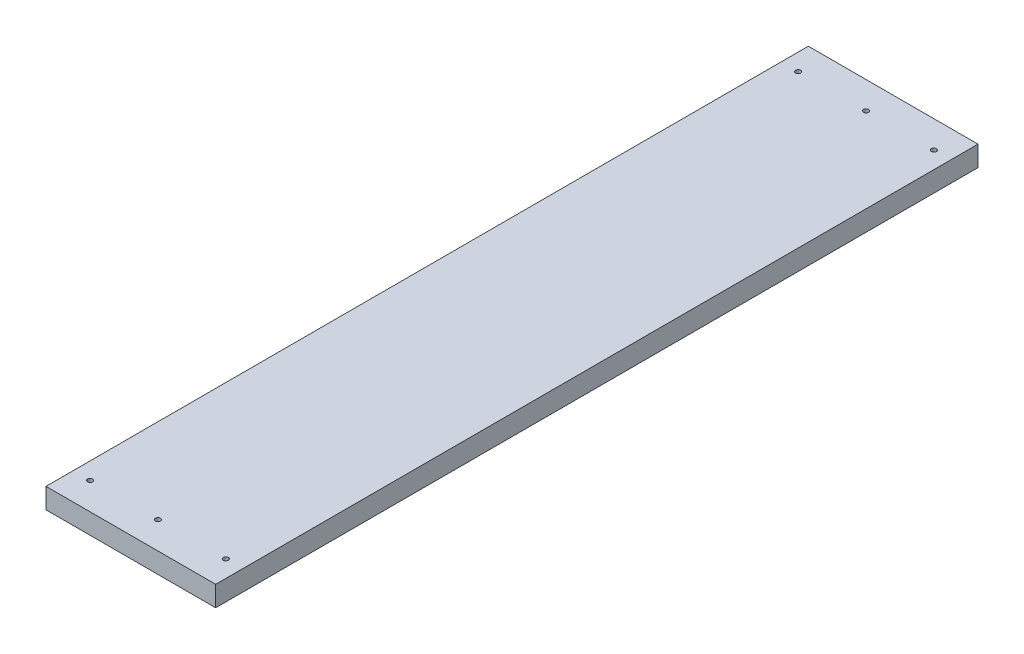
ISO-10303-21;
HEADER;
FILE_DESCRIPTION(('STEP AP214'),'2;1');
FILE_NAME('part.step','',(''),(''),'','','');
FILE_SCHEMA(('AUTOMOTIVE_DESIGN { 1 0 10303 214 1 1 1 1 }'));
ENDSEC;
DATA;
#1=APPLICATION_CONTEXT('core data for automotive mechanical design processes');
#2=APPLICATION_PROTOCOL_DEFINITION('international standard','automotive_design',2000,#1);
#3=PRODUCT_CONTEXT('',#1,'mechanical');
#4=PRODUCT('Part','Part','',(#3));
#5=PRODUCT_RELATED_PRODUCT_CATEGORY('part','',(#4));
#6=PRODUCT_DEFINITION_FORMATION('','',#4);
#7=PRODUCT_DEFINITION_CONTEXT('part definition',#1,'design');
#8=PRODUCT_DEFINITION('design','',#6,#7);
#9=PRODUCT_DEFINITION_SHAPE('','',#8);
#10=(LENGTH_UNIT() NAMED_UNIT(*) SI_UNIT(.MILLI.,.METRE.));
#11=(NAMED_UNIT(*) PLANE_ANGLE_UNIT() SI_UNIT($,.RADIAN.));
#12=(NAMED_UNIT(*) SI_UNIT($,.STERADIAN.) SOLID_ANGLE_UNIT());
#13=UNCERTAINTY_MEASURE_WITH_UNIT(LENGTH_MEASURE(1.E-05),#10,'distance_accuracy_value','');
#14=(GEOMETRIC_REPRESENTATION_CONTEXT(3) GLOBAL_UNCERTAINTY_ASSIGNED_CONTEXT((#13)) GLOBAL_UNIT_ASSIGNED_CONTEXT((#10,
#11,#12)) REPRESENTATION_CONTEXT('',''));
#15=CARTESIAN_POINT('',(0.,0.,0.));
#16=DIRECTION('',(0.,0.,1.));
#17=DIRECTION('',(1.,0.,0.));
#18=AXIS2_PLACEMENT_3D('',#15,#16,#17);
#19=CARTESIAN_POINT('',(-75.,9.,-337.));
#20=DIRECTION('',(0.,0.,-1.));
#21=DIRECTION('',(-1.,0.,0.));
#22=AXIS2_PLACEMENT_3D('',#19,#20,#21);
#23=PLANE('',#22);
#24=DIRECTION('',(1.,0.,0.));
#25=VECTOR('',#24,1.);
#26=CARTESIAN_POINT('',(-75.,-9.,-337.));
#27=LINE('',#26,#25);
#28=CARTESIAN_POINT('',(-75.,-9.,-337.));
#29=VERTEX_POINT('',#28);
#30=CARTESIAN_POINT('',(75.,-9.,-337.));
#31=VERTEX_POINT('',#30);
#32=EDGE_CURVE('E190',#29,#31,#27,.T.);
#33=ORIENTED_EDGE('',*,*,#32,.F.);
#34=DIRECTION('',(0.,-1.,0.));
#35=VECTOR('',#34,1.);
#36=CARTESIAN_POINT('',(-75.,9.,-337.));
#37=LINE('',#36,#35);
#38=CARTESIAN_POINT('',(-75.,9.,-337.));
#39=VERTEX_POINT('',#38);
#40=EDGE_CURVE('E11',#39,#29,#37,.T.);
#41=ORIENTED_EDGE('',*,*,#40,.F.);
#42=DIRECTION('',(1.,0.,0.));
#43=VECTOR('',#42,1.);
#44=CARTESIAN_POINT('',(-75.,9.,-337.));
#45=LINE('',#44,#43);
#46=CARTESIAN_POINT('',(75.,9.,-337.));
#47=VERTEX_POINT('',#46);
#48=EDGE_CURVE('E191',#39,#47,#45,.T.);
#49=ORIENTED_EDGE('',*,*,#48,.T.);
#50=DIRECTION('',(0.,-1.,0.));
#51=VECTOR('',#50,1.);
#52=CARTESIAN_POINT('',(75.,9.,-337.));
#53=LINE('',#52,#51);
#54=EDGE_CURVE('E50',#47,#31,#53,.T.);
#55=ORIENTED_EDGE('',*,*,#54,.T.);
#56=EDGE_LOOP('',(#33,#41,#49,#55));
#57=FACE_BOUND('',#56,.T.);
#58=ADVANCED_FACE('F47',(#57),#23,.T.);
#59=CARTESIAN_POINT('',(-75.,9.,-337.));
#60=DIRECTION('',(1.,0.,0.));
#61=DIRECTION('',(0.,0.,-1.));
#62=AXIS2_PLACEMENT_3D('',#59,#60,#61);
#63=PLANE('',#62);
#64=CARTESIAN_POINT('',(-75.,0.,-249.));
#65=DIRECTION('',(-1.,0.,0.));
#66=DIRECTION('',(0.,0.,1.));
#67=AXIS2_PLACEMENT_3D('',#64,#65,#66);
#68=CIRCLE('',#67,1.72719999999999);
#69=CARTESIAN_POINT('',(-75.,0.,-247.2728));
#70=VERTEX_POINT('',#69);
#71=EDGE_CURVE('E114',#70,#70,#68,.T.);
#72=ORIENTED_EDGE('',*,*,#71,.F.);
#73=EDGE_LOOP('',(#72));
#74=FACE_BOUND('',#73,.T.);
#75=CARTESIAN_POINT('',(-75.,0.,-225.));
#76=DIRECTION('',(-1.,0.,0.));
#77=DIRECTION('',(0.,0.,1.));
#78=AXIS2_PLACEMENT_3D('',#75,#76,#77);
#79=CIRCLE('',#78,1.72719999999999);
#80=CARTESIAN_POINT('',(-75.,0.,-223.2728));
#81=VERTEX_POINT('',#80);
#82=EDGE_CURVE('E113',#81,#81,#79,.T.);
#83=ORIENTED_EDGE('',*,*,#82,.F.);
#84=EDGE_LOOP('',(#83));
#85=FACE_BOUND('',#84,.T.);
#86=CARTESIAN_POINT('',(-75.,0.,249.));
#87=DIRECTION('',(-1.,0.,0.));
#88=DIRECTION('',(0.,0.,1.));
#89=AXIS2_PLACEMENT_3D('',#86,#87,#88);
#90=CIRCLE('',#89,1.72719999999999);
#91=CARTESIAN_POINT('',(-75.,0.,250.7272));
#92=VERTEX_POINT('',#91);
#93=EDGE_CURVE('E151',#92,#92,#90,.T.);
#94=ORIENTED_EDGE('',*,*,#93,.F.);
#95=EDGE_LOOP('',(#94));
#96=FACE_BOUND('',#95,.T.);
#97=CARTESIAN_POINT('',(-75.,0.,225.));
#98=DIRECTION('',(-1.,0.,0.));
#99=DIRECTION('',(0.,0.,1.));
#100=AXIS2_PLACEMENT_3D('',#97,#98,#99);
#101=CIRCLE('',#100,1.72719999999999);
#102=CARTESIAN_POINT('',(-75.,0.,226.7272));
#103=VERTEX_POINT('',#102);
#104=EDGE_CURVE('E157',#103,#103,#101,.T.);
#105=ORIENTED_EDGE('',*,*,#104,.F.);
#106=EDGE_LOOP('',(#105));
#107=FACE_BOUND('',#106,.T.);
#108=DIRECTION('',(0.,0.,1.));
#109=VECTOR('',#108,1.);
#110=CARTESIAN_POINT('',(-75.,-9.,-337.));
#111=LINE('',#110,#109);
#112=CARTESIAN_POINT('',(-74.9999999999999,-9.,337.));
#113=VERTEX_POINT('',#112);
#114=EDGE_CURVE('E81',#29,#113,#111,.T.);
#115=ORIENTED_EDGE('',*,*,#114,.T.);
#116=DIRECTION('',(0.,-1.,0.));
#117=VECTOR('',#116,1.);
#118=CARTESIAN_POINT('',(-74.9999999999999,9.,337.));
#119=LINE('',#118,#117);
#120=CARTESIAN_POINT('',(-74.9999999999999,9.,337.));
#121=VERTEX_POINT('',#120);
#122=EDGE_CURVE('E56',#121,#113,#119,.T.);
#123=ORIENTED_EDGE('',*,*,#122,.F.);
#124=DIRECTION('',(0.,0.,1.));
#125=VECTOR('',#124,1.);
#126=CARTESIAN_POINT('',(-75.,9.,-337.));
#127=LINE('',#126,#125);
#128=EDGE_CURVE('E197',#39,#121,#127,.T.);
#129=ORIENTED_EDGE('',*,*,#128,.F.);
#130=ORIENTED_EDGE('',*,*,#40,.T.);
#131=EDGE_LOOP('',(#115,#123,#129,#130));
#132=FACE_BOUND('',#131,.T.);
#133=ADVANCED_FACE('F218',(#74,#85,#96,#107,#132),#63,.F.);
#134=CARTESIAN_POINT('',(-74.9999999999999,9.,337.));
#135=DIRECTION('',(0.,0.,-1.));
#136=DIRECTION('',(-1.,0.,0.));
#137=AXIS2_PLACEMENT_3D('',#134,#135,#136);
#138=PLANE('',#137);
#139=DIRECTION('',(1.,0.,0.));
#140=VECTOR('',#139,1.);
#141=CARTESIAN_POINT('',(-74.9999999999999,-9.,337.));
#142=LINE('',#141,#140);
#143=CARTESIAN_POINT('',(75.0000000000001,-9.,337.));
#144=VERTEX_POINT('',#143);
#145=EDGE_CURVE('E204',#113,#144,#142,.T.);
#146=ORIENTED_EDGE('',*,*,#145,.T.);
#147=DIRECTION('',(0.,-1.,0.));
#148=VECTOR('',#147,1.);
#149=CARTESIAN_POINT('',(75.0000000000001,9.,337.));
#150=LINE('',#149,#148);
#151=CARTESIAN_POINT('',(75.0000000000001,9.,337.));
#152=VERTEX_POINT('',#151);
#153=EDGE_CURVE('E208',#152,#144,#150,.T.);
#154=ORIENTED_EDGE('',*,*,#153,.F.);
#155=DIRECTION('',(1.,0.,0.));
#156=VECTOR('',#155,1.);
#157=CARTESIAN_POINT('',(-74.9999999999999,9.,337.));
#158=LINE('',#157,#156);
#159=EDGE_CURVE('E195',#121,#152,#158,.T.);
#160=ORIENTED_EDGE('',*,*,#159,.F.);
#161=ORIENTED_EDGE('',*,*,#122,.T.);
#162=EDGE_LOOP('',(#146,#154,#160,#161));
#163=FACE_BOUND('',#162,.T.);
#164=ADVANCED_FACE('F216',(#163),#138,.F.);
#165=CARTESIAN_POINT('',(75.,9.,-337.));
#166=DIRECTION('',(1.,0.,0.));
#167=DIRECTION('',(0.,0.,-1.));
#168=AXIS2_PLACEMENT_3D('',#165,#166,#167);
#169=PLANE('',#168);
#170=DIRECTION('',(0.,0.,1.));
#171=VECTOR('',#170,1.);
#172=CARTESIAN_POINT('',(75.,-9.,-337.));
#173=LINE('',#172,#171);
#174=EDGE_CURVE('E201',#31,#144,#173,.T.);
#175=ORIENTED_EDGE('',*,*,#174,.F.);
#176=ORIENTED_EDGE('',*,*,#54,.F.);
#177=DIRECTION('',(0.,0.,1.));
#178=VECTOR('',#177,1.);
#179=CARTESIAN_POINT('',(75.,9.,-337.));
#180=LINE('',#179,#178);
#181=EDGE_CURVE('E193',#47,#152,#180,.T.);
#182=ORIENTED_EDGE('',*,*,#181,.T.);
#183=ORIENTED_EDGE('',*,*,#153,.T.);
#184=EDGE_LOOP('',(#175,#176,#182,#183));
#185=FACE_BOUND('',#184,.T.);
#186=ADVANCED_FACE('F211',(#185),#169,.T.);
#187=CARTESIAN_POINT('',(0.,9.,0.));
#188=DIRECTION('',(0.,-1.,0.));
#189=DIRECTION('',(0.,0.,-1.));
#190=AXIS2_PLACEMENT_3D('',#187,#188,#189);
#191=PLANE('',#190);
#192=CARTESIAN_POINT('',(60.,9.,-313.));
#193=DIRECTION('',(0.,-1.,0.));
#194=DIRECTION('',(0.,0.,-1.));
#195=AXIS2_PLACEMENT_3D('',#192,#193,#194);
#196=CIRCLE('',#195,2.24789999999998);
#197=CARTESIAN_POINT('',(60.,9.,-315.2479));
#198=VERTEX_POINT('',#197);
#199=EDGE_CURVE('E130',#198,#198,#196,.T.);
#200=ORIENTED_EDGE('',*,*,#199,.T.);
#201=EDGE_LOOP('',(#200));
#202=FACE_BOUND('',#201,.T.);
#203=CARTESIAN_POINT('',(0.,9.,-313.));
#204=DIRECTION('',(0.,-1.,0.));
#205=DIRECTION('',(0.,0.,-1.));
#206=AXIS2_PLACEMENT_3D('',#203,#204,#205);
#207=CIRCLE('',#206,2.24789999999999);
#208=CARTESIAN_POINT('',(0.,9.,-315.2479));
#209=VERTEX_POINT('',#208);
#210=EDGE_CURVE('E139',#209,#209,#207,.T.);
#211=ORIENTED_EDGE('',*,*,#210,.T.);
#212=EDGE_LOOP('',(#211));
#213=FACE_BOUND('',#212,.T.);
#214=CARTESIAN_POINT('',(-59.9999999999999,9.,-313.));
#215=DIRECTION('',(0.,-1.,0.));
#216=DIRECTION('',(0.,0.,-1.));
#217=AXIS2_PLACEMENT_3D('',#214,#215,#216);
#218=CIRCLE('',#217,2.24789999999998);
#219=CARTESIAN_POINT('',(-59.9999999999999,9.,-315.2479));
#220=VERTEX_POINT('',#219);
#221=EDGE_CURVE('E148',#220,#220,#218,.T.);
#222=ORIENTED_EDGE('',*,*,#221,.T.);
#223=EDGE_LOOP('',(#222));
#224=FACE_BOUND('',#223,.T.);
#225=CARTESIAN_POINT('',(60.,9.,313.));
#226=DIRECTION('',(0.,-1.,0.));
#227=DIRECTION('',(0.,0.,-1.));
#228=AXIS2_PLACEMENT_3D('',#225,#226,#227);
#229=CIRCLE('',#228,2.24789999999998);
#230=CARTESIAN_POINT('',(60.,9.,310.7521));
#231=VERTEX_POINT('',#230);
#232=EDGE_CURVE('E169',#231,#231,#229,.T.);
#233=ORIENTED_EDGE('',*,*,#232,.T.);
#234=EDGE_LOOP('',(#233));
#235=FACE_BOUND('',#234,.T.);
#236=CARTESIAN_POINT('',(0.,9.,313.));
#237=DIRECTION('',(0.,-1.,0.));
#238=DIRECTION('',(0.,0.,-1.));
#239=AXIS2_PLACEMENT_3D('',#236,#237,#238);
#240=CIRCLE('',#239,2.24789999999999);
#241=CARTESIAN_POINT('',(0.,9.,310.7521));
#242=VERTEX_POINT('',#241);
#243=EDGE_CURVE('E178',#242,#242,#240,.T.);
#244=ORIENTED_EDGE('',*,*,#243,.T.);
#245=EDGE_LOOP('',(#244));
#246=FACE_BOUND('',#245,.T.);
#247=CARTESIAN_POINT('',(-59.9999999999999,9.,313.));
#248=DIRECTION('',(0.,-1.,0.));
#249=DIRECTION('',(0.,0.,-1.));
#250=AXIS2_PLACEMENT_3D('',#247,#248,#249);
#251=CIRCLE('',#250,2.24789999999998);
#252=CARTESIAN_POINT('',(-59.9999999999999,9.,310.7521));
#253=VERTEX_POINT('',#252);
#254=EDGE_CURVE('E187',#253,#253,#251,.T.);
#255=ORIENTED_EDGE('',*,*,#254,.T.);
#256=EDGE_LOOP('',(#255));
#257=FACE_BOUND('',#256,.T.);
#258=ORIENTED_EDGE('',*,*,#48,.F.);
#259=ORIENTED_EDGE('',*,*,#128,.T.);
#260=ORIENTED_EDGE('',*,*,#159,.T.);
#261=ORIENTED_EDGE('',*,*,#181,.F.);
#262=EDGE_LOOP('',(#258,#259,#260,#261));
#263=FACE_BOUND('',#262,.T.);
#264=ADVANCED_FACE('F220',(#202,#213,#224,#235,#246,#257,#263),#191,.F.);
#265=CARTESIAN_POINT('',(0.,-9.,0.));
#266=DIRECTION('',(0.,-1.,0.));
#267=DIRECTION('',(0.,0.,-1.));
#268=AXIS2_PLACEMENT_3D('',#265,#266,#267);
#269=PLANE('',#268);
#270=CARTESIAN_POINT('',(60.,-9.,-313.));
#271=DIRECTION('',(0.,-1.,0.));
#272=DIRECTION('',(0.,0.,-1.));
#273=AXIS2_PLACEMENT_3D('',#270,#271,#272);
#274=CIRCLE('',#273,4.21639999999999);
#275=CARTESIAN_POINT('',(60.,-9.,-317.2164));
#276=VERTEX_POINT('',#275);
#277=EDGE_CURVE('E124',#276,#276,#274,.T.);
#278=ORIENTED_EDGE('',*,*,#277,.F.);
#279=EDGE_LOOP('',(#278));
#280=FACE_BOUND('',#279,.T.);
#281=CARTESIAN_POINT('',(0.,-9.,-313.));
#282=DIRECTION('',(0.,-1.,0.));
#283=DIRECTION('',(0.,0.,-1.));
#284=AXIS2_PLACEMENT_3D('',#281,#282,#283);
#285=CIRCLE('',#284,4.2164);
#286=CARTESIAN_POINT('',(0.,-9.,-317.2164));
#287=VERTEX_POINT('',#286);
#288=EDGE_CURVE('E133',#287,#287,#285,.T.);
#289=ORIENTED_EDGE('',*,*,#288,.F.);
#290=EDGE_LOOP('',(#289));
#291=FACE_BOUND('',#290,.T.);
#292=CARTESIAN_POINT('',(-59.9999999999999,-9.,-313.));
#293=DIRECTION('',(0.,-1.,0.));
#294=DIRECTION('',(0.,0.,-1.));
#295=AXIS2_PLACEMENT_3D('',#292,#293,#294);
#296=CIRCLE('',#295,4.2164);
#297=CARTESIAN_POINT('',(-59.9999999999999,-9.,-317.2164));
#298=VERTEX_POINT('',#297);
#299=EDGE_CURVE('E142',#298,#298,#296,.T.);
#300=ORIENTED_EDGE('',*,*,#299,.F.);
#301=EDGE_LOOP('',(#300));
#302=FACE_BOUND('',#301,.T.);
#303=CARTESIAN_POINT('',(60.,-9.,313.));
#304=DIRECTION('',(0.,-1.,0.));
#305=DIRECTION('',(0.,0.,-1.));
#306=AXIS2_PLACEMENT_3D('',#303,#304,#305);
#307=CIRCLE('',#306,4.21639999999999);
#308=CARTESIAN_POINT('',(60.,-9.,308.7836));
#309=VERTEX_POINT('',#308);
#310=EDGE_CURVE('E163',#309,#309,#307,.T.);
#311=ORIENTED_EDGE('',*,*,#310,.F.);
#312=EDGE_LOOP('',(#311));
#313=FACE_BOUND('',#312,.T.);
#314=CARTESIAN_POINT('',(0.,-9.,313.));
#315=DIRECTION('',(0.,-1.,0.));
#316=DIRECTION('',(0.,0.,-1.));
#317=AXIS2_PLACEMENT_3D('',#314,#315,#316);
#318=CIRCLE('',#317,4.2164);
#319=CARTESIAN_POINT('',(0.,-9.,308.7836));
#320=VERTEX_POINT('',#319);
#321=EDGE_CURVE('E172',#320,#320,#318,.T.);
#322=ORIENTED_EDGE('',*,*,#321,.F.);
#323=EDGE_LOOP('',(#322));
#324=FACE_BOUND('',#323,.T.);
#325=CARTESIAN_POINT('',(-59.9999999999999,-9.,313.));
#326=DIRECTION('',(0.,-1.,0.));
#327=DIRECTION('',(0.,0.,-1.));
#328=AXIS2_PLACEMENT_3D('',#325,#326,#327);
#329=CIRCLE('',#328,4.2164);
#330=CARTESIAN_POINT('',(-59.9999999999999,-9.,308.7836));
#331=VERTEX_POINT('',#330);
#332=EDGE_CURVE('E181',#331,#331,#329,.T.);
#333=ORIENTED_EDGE('',*,*,#332,.F.);
#334=EDGE_LOOP('',(#333));
#335=FACE_BOUND('',#334,.T.);
#336=ORIENTED_EDGE('',*,*,#32,.T.);
#337=ORIENTED_EDGE('',*,*,#174,.T.);
#338=ORIENTED_EDGE('',*,*,#145,.F.);
#339=ORIENTED_EDGE('',*,*,#114,.F.);
#340=EDGE_LOOP('',(#336,#337,#338,#339));
#341=FACE_BOUND('',#340,.T.);
#342=ADVANCED_FACE('F214',(#280,#291,#302,#313,#324,#335,#341),#269,.T.);
#343=CARTESIAN_POINT('',(-59.9999999999999,-9.,313.));
#344=DIRECTION('',(0.,-1.,0.));
#345=DIRECTION('',(0.,0.,-1.));
#346=AXIS2_PLACEMENT_3D('',#343,#344,#345);
#347=CYLINDRICAL_SURFACE('',#346,2.24789999999999);
#348=ORIENTED_EDGE('',*,*,#254,.F.);
#349=EDGE_LOOP('',(#348));
#350=FACE_BOUND('',#349,.T.);
#351=CARTESIAN_POINT('',(-59.9999999999999,-7.34823237602752,313.));
#352=DIRECTION('',(0.,-1.,0.));
#353=DIRECTION('',(0.,0.,-1.));
#354=AXIS2_PLACEMENT_3D('',#351,#352,#353);
#355=CIRCLE('',#354,2.24789999999999);
#356=CARTESIAN_POINT('',(-59.9999999999999,-7.34823237602752,310.7521));
#357=VERTEX_POINT('',#356);
#358=EDGE_CURVE('E184',#357,#357,#355,.T.);
#359=ORIENTED_EDGE('',*,*,#358,.T.);
#360=EDGE_LOOP('',(#359));
#361=FACE_BOUND('',#360,.T.);
#362=ADVANCED_FACE('F228',(#350,#361),#347,.F.);
#363=CARTESIAN_POINT('',(-59.9999999999999,-9.,313.));
#364=DIRECTION('',(0.,-1.,0.));
#365=DIRECTION('',(0.,0.,-1.));
#366=AXIS2_PLACEMENT_3D('',#363,#364,#365);
#367=CONICAL_SURFACE('',#366,4.2164,0.872664625997165);
#368=ORIENTED_EDGE('',*,*,#358,.F.);
#369=EDGE_LOOP('',(#368));
#370=FACE_BOUND('',#369,.T.);
#371=ORIENTED_EDGE('',*,*,#332,.T.);
#372=EDGE_LOOP('',(#371));
#373=FACE_BOUND('',#372,.T.);
#374=ADVANCED_FACE('F288',(#370,#373),#367,.F.);
#375=CARTESIAN_POINT('',(0.,-9.,313.));
#376=DIRECTION('',(0.,-1.,0.));
#377=DIRECTION('',(0.,0.,-1.));
#378=AXIS2_PLACEMENT_3D('',#375,#376,#377);
#379=CYLINDRICAL_SURFACE('',#378,2.24789999999999);
#380=ORIENTED_EDGE('',*,*,#243,.F.);
#381=EDGE_LOOP('',(#380));
#382=FACE_BOUND('',#381,.T.);
#383=CARTESIAN_POINT('',(0.,-7.34823237602752,313.));
#384=DIRECTION('',(0.,-1.,0.));
#385=DIRECTION('',(0.,0.,-1.));
#386=AXIS2_PLACEMENT_3D('',#383,#384,#385);
#387=CIRCLE('',#386,2.24789999999999);
#388=CARTESIAN_POINT('',(0.,-7.34823237602752,310.7521));
#389=VERTEX_POINT('',#388);
#390=EDGE_CURVE('E175',#389,#389,#387,.T.);
#391=ORIENTED_EDGE('',*,*,#390,.T.);
#392=EDGE_LOOP('',(#391));
#393=FACE_BOUND('',#392,.T.);
#394=ADVANCED_FACE('F284',(#382,#393),#379,.F.);
#395=CARTESIAN_POINT('',(0.,-9.,313.));
#396=DIRECTION('',(0.,-1.,0.));
#397=DIRECTION('',(0.,0.,-1.));
#398=AXIS2_PLACEMENT_3D('',#395,#396,#397);
#399=CONICAL_SURFACE('',#398,4.2164,0.872664625997165);
#400=ORIENTED_EDGE('',*,*,#390,.F.);
#401=EDGE_LOOP('',(#400));
#402=FACE_BOUND('',#401,.T.);
#403=ORIENTED_EDGE('',*,*,#321,.T.);
#404=EDGE_LOOP('',(#403));
#405=FACE_BOUND('',#404,.T.);
#406=ADVANCED_FACE('F280',(#402,#405),#399,.F.);
#407=CARTESIAN_POINT('',(60.,-9.,313.));
#408=DIRECTION('',(0.,-1.,0.));
#409=DIRECTION('',(0.,0.,-1.));
#410=AXIS2_PLACEMENT_3D('',#407,#408,#409);
#411=CYLINDRICAL_SURFACE('',#410,2.24789999999999);
#412=ORIENTED_EDGE('',*,*,#232,.F.);
#413=EDGE_LOOP('',(#412));
#414=FACE_BOUND('',#413,.T.);
#415=CARTESIAN_POINT('',(60.,-7.34823237602752,313.));
#416=DIRECTION('',(0.,-1.,0.));
#417=DIRECTION('',(0.,0.,-1.));
#418=AXIS2_PLACEMENT_3D('',#415,#416,#417);
#419=CIRCLE('',#418,2.24789999999999);
#420=CARTESIAN_POINT('',(60.,-7.34823237602752,310.7521));
#421=VERTEX_POINT('',#420);
#422=EDGE_CURVE('E166',#421,#421,#419,.T.);
#423=ORIENTED_EDGE('',*,*,#422,.T.);
#424=EDGE_LOOP('',(#423));
#425=FACE_BOUND('',#424,.T.);
#426=ADVANCED_FACE('F276',(#414,#425),#411,.F.);
#427=CARTESIAN_POINT('',(60.,-9.,313.));
#428=DIRECTION('',(0.,-1.,0.));
#429=DIRECTION('',(0.,0.,-1.));
#430=AXIS2_PLACEMENT_3D('',#427,#428,#429);
#431=CONICAL_SURFACE('',#430,4.21639999999999,0.872664625997163);
#432=ORIENTED_EDGE('',*,*,#422,.F.);
#433=EDGE_LOOP('',(#432));
#434=FACE_BOUND('',#433,.T.);
#435=ORIENTED_EDGE('',*,*,#310,.T.);
#436=EDGE_LOOP('',(#435));
#437=FACE_BOUND('',#436,.T.);
#438=ADVANCED_FACE('F268',(#434,#437),#431,.F.);
#439=CARTESIAN_POINT('',(-50.,0.,225.));
#440=DIRECTION('',(-1.,0.,0.));
#441=DIRECTION('',(0.,0.,1.));
#442=AXIS2_PLACEMENT_3D('',#439,#440,#441);
#443=CONICAL_SURFACE('',#442,1.72719999999999,1.02974425867665);
#444=CARTESIAN_POINT('',(-48.9621935388155,0.,225.));
#445=VERTEX_POINT('',#444);
#446=VERTEX_LOOP('',#445);
#447=FACE_BOUND('',#446,.T.);
#448=CARTESIAN_POINT('',(-50.,0.,225.));
#449=DIRECTION('',(-1.,0.,0.));
#450=DIRECTION('',(0.,0.,1.));
#451=AXIS2_PLACEMENT_3D('',#448,#449,#450);
#452=CIRCLE('',#451,1.72719999999999);
#453=CARTESIAN_POINT('',(-50.,0.,226.7272));
#454=VERTEX_POINT('',#453);
#455=EDGE_CURVE('E160',#454,#454,#452,.T.);
#456=ORIENTED_EDGE('',*,*,#455,.T.);
#457=EDGE_LOOP('',(#456));
#458=FACE_BOUND('',#457,.T.);
#459=ADVANCED_FACE('F257',(#447,#458),#443,.F.);
#460=CARTESIAN_POINT('',(-75.,0.,225.));
#461=DIRECTION('',(-1.,0.,0.));
#462=DIRECTION('',(0.,0.,1.));
#463=AXIS2_PLACEMENT_3D('',#460,#461,#462);
#464=CYLINDRICAL_SURFACE('',#463,1.72719999999999);
#465=ORIENTED_EDGE('',*,*,#455,.F.);
#466=EDGE_LOOP('',(#465));
#467=FACE_BOUND('',#466,.T.);
#468=ORIENTED_EDGE('',*,*,#104,.T.);
#469=EDGE_LOOP('',(#468));
#470=FACE_BOUND('',#469,.T.);
#471=ADVANCED_FACE('F254',(#467,#470),#464,.F.);
#472=CARTESIAN_POINT('',(-50.,0.,249.));
#473=DIRECTION('',(-1.,0.,0.));
#474=DIRECTION('',(0.,0.,1.));
#475=AXIS2_PLACEMENT_3D('',#472,#473,#474);
#476=CONICAL_SURFACE('',#475,1.72719999999999,1.02974425867665);
#477=CARTESIAN_POINT('',(-48.9621935388155,0.,249.));
#478=VERTEX_POINT('',#477);
#479=VERTEX_LOOP('',#478);
#480=FACE_BOUND('',#479,.T.);
#481=CARTESIAN_POINT('',(-50.,0.,249.));
#482=DIRECTION('',(-1.,0.,0.));
#483=DIRECTION('',(0.,0.,1.));
#484=AXIS2_PLACEMENT_3D('',#481,#482,#483);
#485=CIRCLE('',#484,1.72719999999999);
#486=CARTESIAN_POINT('',(-50.,0.,250.7272));
#487=VERTEX_POINT('',#486);
#488=EDGE_CURVE('E154',#487,#487,#485,.T.);
#489=ORIENTED_EDGE('',*,*,#488,.T.);
#490=EDGE_LOOP('',(#489));
#491=FACE_BOUND('',#490,.T.);
#492=ADVANCED_FACE('F256',(#480,#491),#476,.F.);
#493=CARTESIAN_POINT('',(-75.,0.,249.));
#494=DIRECTION('',(-1.,0.,0.));
#495=DIRECTION('',(0.,0.,1.));
#496=AXIS2_PLACEMENT_3D('',#493,#494,#495);
#497=CYLINDRICAL_SURFACE('',#496,1.72719999999999);
#498=ORIENTED_EDGE('',*,*,#488,.F.);
#499=EDGE_LOOP('',(#498));
#500=FACE_BOUND('',#499,.T.);
#501=ORIENTED_EDGE('',*,*,#93,.T.);
#502=EDGE_LOOP('',(#501));
#503=FACE_BOUND('',#502,.T.);
#504=ADVANCED_FACE('F264',(#500,#503),#497,.F.);
#505=CARTESIAN_POINT('',(-59.9999999999999,-9.,-313.));
#506=DIRECTION('',(0.,-1.,0.));
#507=DIRECTION('',(0.,0.,-1.));
#508=AXIS2_PLACEMENT_3D('',#505,#506,#507);
#509=CYLINDRICAL_SURFACE('',#508,2.24789999999999);
#510=ORIENTED_EDGE('',*,*,#221,.F.);
#511=EDGE_LOOP('',(#510));
#512=FACE_BOUND('',#511,.T.);
#513=CARTESIAN_POINT('',(-59.9999999999999,-7.34823237602752,-313.));
#514=DIRECTION('',(0.,-1.,0.));
#515=DIRECTION('',(0.,0.,-1.));
#516=AXIS2_PLACEMENT_3D('',#513,#514,#515);
#517=CIRCLE('',#516,2.24789999999999);
#518=CARTESIAN_POINT('',(-59.9999999999999,-7.34823237602752,-315.2479));
#519=VERTEX_POINT('',#518);
#520=EDGE_CURVE('E145',#519,#519,#517,.T.);
#521=ORIENTED_EDGE('',*,*,#520,.T.);
#522=EDGE_LOOP('',(#521));
#523=FACE_BOUND('',#522,.T.);
#524=ADVANCED_FACE('F357',(#512,#523),#509,.F.);
#525=CARTESIAN_POINT('',(-59.9999999999999,-9.,-313.));
#526=DIRECTION('',(0.,-1.,0.));
#527=DIRECTION('',(0.,0.,-1.));
#528=AXIS2_PLACEMENT_3D('',#525,#526,#527);
#529=CONICAL_SURFACE('',#528,4.2164,0.872664625997165);
#530=ORIENTED_EDGE('',*,*,#520,.F.);
#531=EDGE_LOOP('',(#530));
#532=FACE_BOUND('',#531,.T.);
#533=ORIENTED_EDGE('',*,*,#299,.T.);
#534=EDGE_LOOP('',(#533));
#535=FACE_BOUND('',#534,.T.);
#536=ADVANCED_FACE('F437',(#532,#535),#529,.F.);
#537=CARTESIAN_POINT('',(0.,-9.,-313.));
#538=DIRECTION('',(0.,-1.,0.));
#539=DIRECTION('',(0.,0.,-1.));
#540=AXIS2_PLACEMENT_3D('',#537,#538,#539);
#541=CYLINDRICAL_SURFACE('',#540,2.24789999999999);
#542=ORIENTED_EDGE('',*,*,#210,.F.);
#543=EDGE_LOOP('',(#542));
#544=FACE_BOUND('',#543,.T.);
#545=CARTESIAN_POINT('',(0.,-7.34823237602752,-313.));
#546=DIRECTION('',(0.,-1.,0.));
#547=DIRECTION('',(0.,0.,-1.));
#548=AXIS2_PLACEMENT_3D('',#545,#546,#547);
#549=CIRCLE('',#548,2.24789999999999);
#550=CARTESIAN_POINT('',(0.,-7.34823237602752,-315.2479));
#551=VERTEX_POINT('',#550);
#552=EDGE_CURVE('E136',#551,#551,#549,.T.);
#553=ORIENTED_EDGE('',*,*,#552,.T.);
#554=EDGE_LOOP('',(#553));
#555=FACE_BOUND('',#554,.T.);
#556=ADVANCED_FACE('F446',(#544,#555),#541,.F.);
#557=CARTESIAN_POINT('',(0.,-9.,-313.));
#558=DIRECTION('',(0.,-1.,0.));
#559=DIRECTION('',(0.,0.,-1.));
#560=AXIS2_PLACEMENT_3D('',#557,#558,#559);
#561=CONICAL_SURFACE('',#560,4.2164,0.872664625997165);
#562=ORIENTED_EDGE('',*,*,#552,.F.);
#563=EDGE_LOOP('',(#562));
#564=FACE_BOUND('',#563,.T.);
#565=ORIENTED_EDGE('',*,*,#288,.T.);
#566=EDGE_LOOP('',(#565));
#567=FACE_BOUND('',#566,.T.);
#568=ADVANCED_FACE('F455',(#564,#567),#561,.F.);
#569=CARTESIAN_POINT('',(60.,-9.,-313.));
#570=DIRECTION('',(0.,-1.,0.));
#571=DIRECTION('',(0.,0.,-1.));
#572=AXIS2_PLACEMENT_3D('',#569,#570,#571);
#573=CYLINDRICAL_SURFACE('',#572,2.24789999999999);
#574=ORIENTED_EDGE('',*,*,#199,.F.);
#575=EDGE_LOOP('',(#574));
#576=FACE_BOUND('',#575,.T.);
#577=CARTESIAN_POINT('',(60.,-7.34823237602752,-313.));
#578=DIRECTION('',(0.,-1.,0.));
#579=DIRECTION('',(0.,0.,-1.));
#580=AXIS2_PLACEMENT_3D('',#577,#578,#579);
#581=CIRCLE('',#580,2.24789999999999);
#582=CARTESIAN_POINT('',(60.,-7.34823237602752,-315.2479));
#583=VERTEX_POINT('',#582);
#584=EDGE_CURVE('E127',#583,#583,#581,.T.);
#585=ORIENTED_EDGE('',*,*,#584,.T.);
#586=EDGE_LOOP('',(#585));
#587=FACE_BOUND('',#586,.T.);
#588=ADVANCED_FACE('F464',(#576,#587),#573,.F.);
#589=CARTESIAN_POINT('',(60.,-9.,-313.));
#590=DIRECTION('',(0.,-1.,0.));
#591=DIRECTION('',(0.,0.,-1.));
#592=AXIS2_PLACEMENT_3D('',#589,#590,#591);
#593=CONICAL_SURFACE('',#592,4.21639999999999,0.872664625997163);
#594=ORIENTED_EDGE('',*,*,#584,.F.);
#595=EDGE_LOOP('',(#594));
#596=FACE_BOUND('',#595,.T.);
#597=ORIENTED_EDGE('',*,*,#277,.T.);
#598=EDGE_LOOP('',(#597));
#599=FACE_BOUND('',#598,.T.);
#600=ADVANCED_FACE('F473',(#596,#599),#593,.F.);
#601=CARTESIAN_POINT('',(-50.,0.,-225.));
#602=DIRECTION('',(-1.,0.,0.));
#603=DIRECTION('',(0.,0.,1.));
#604=AXIS2_PLACEMENT_3D('',#601,#602,#603);
#605=CONICAL_SURFACE('',#604,1.72719999999999,1.02974425867665);
#606=CARTESIAN_POINT('',(-48.9621935388155,0.,-225.));
#607=VERTEX_POINT('',#606);
#608=VERTEX_LOOP('',#607);
#609=FACE_BOUND('',#608,.T.);
#610=CARTESIAN_POINT('',(-50.,0.,-225.));
#611=DIRECTION('',(-1.,0.,0.));
#612=DIRECTION('',(0.,0.,1.));
#613=AXIS2_PLACEMENT_3D('',#610,#611,#612);
#614=CIRCLE('',#613,1.72719999999999);
#615=CARTESIAN_POINT('',(-50.,0.,-223.2728));
#616=VERTEX_POINT('',#615);
#617=EDGE_CURVE('E117',#616,#616,#614,.T.);
#618=ORIENTED_EDGE('',*,*,#617,.T.);
#619=EDGE_LOOP('',(#618));
#620=FACE_BOUND('',#619,.T.);
#621=ADVANCED_FACE('F387',(#609,#620),#605,.F.);
#622=CARTESIAN_POINT('',(-75.,0.,-225.));
#623=DIRECTION('',(-1.,0.,0.));
#624=DIRECTION('',(0.,0.,1.));
#625=AXIS2_PLACEMENT_3D('',#622,#623,#624);
#626=CYLINDRICAL_SURFACE('',#625,1.72719999999999);
#627=ORIENTED_EDGE('',*,*,#617,.F.);
#628=EDGE_LOOP('',(#627));
#629=FACE_BOUND('',#628,.T.);
#630=ORIENTED_EDGE('',*,*,#82,.T.);
#631=EDGE_LOOP('',(#630));
#632=FACE_BOUND('',#631,.T.);
#633=ADVANCED_FACE('F107',(#629,#632),#626,.F.);
#634=CARTESIAN_POINT('',(-50.,0.,-249.));
#635=DIRECTION('',(-1.,0.,0.));
#636=DIRECTION('',(0.,0.,1.));
#637=AXIS2_PLACEMENT_3D('',#634,#635,#636);
#638=CONICAL_SURFACE('',#637,1.72719999999999,1.02974425867665);
#639=CARTESIAN_POINT('',(-48.9621935388155,0.,-249.));
#640=VERTEX_POINT('',#639);
#641=VERTEX_LOOP('',#640);
#642=FACE_BOUND('',#641,.T.);
#643=CARTESIAN_POINT('',(-50.,0.,-249.));
#644=DIRECTION('',(-1.,0.,0.));
#645=DIRECTION('',(0.,0.,1.));
#646=AXIS2_PLACEMENT_3D('',#643,#644,#645);
#647=CIRCLE('',#646,1.72719999999999);
#648=CARTESIAN_POINT('',(-50.,0.,-247.2728));
#649=VERTEX_POINT('',#648);
#650=EDGE_CURVE('E111',#649,#649,#647,.T.);
#651=ORIENTED_EDGE('',*,*,#650,.T.);
#652=EDGE_LOOP('',(#651));
#653=FACE_BOUND('',#652,.T.);
#654=ADVANCED_FACE('F103',(#642,#653),#638,.F.);
#655=CARTESIAN_POINT('',(-75.,0.,-249.));
#656=DIRECTION('',(-1.,0.,0.));
#657=DIRECTION('',(0.,0.,1.));
#658=AXIS2_PLACEMENT_3D('',#655,#656,#657);
#659=CYLINDRICAL_SURFACE('',#658,1.72719999999999);
#660=ORIENTED_EDGE('',*,*,#650,.F.);
#661=EDGE_LOOP('',(#660));
#662=FACE_BOUND('',#661,.T.);
#663=ORIENTED_EDGE('',*,*,#71,.T.);
#664=EDGE_LOOP('',(#663));
#665=FACE_BOUND('',#664,.T.);
#666=ADVANCED_FACE('F106',(#662,#665),#659,.F.);
#667=CLOSED_SHELL('',(#58,#133,#164,#186,#264,#342,#362,#374,#394,#406,#426,#438,#459,#471,#492,
#504,#524,#536,#556,#568,#588,#600,#621,#633,#654,#666));
#668=MANIFOLD_SOLID_BREP('B2',#667);
#669=ADVANCED_BREP_SHAPE_REPRESENTATION('',(#18,#668),#14);
#670=SHAPE_DEFINITION_REPRESENTATION(#9,#669);
ENDSEC;
END-ISO-10303-21;
